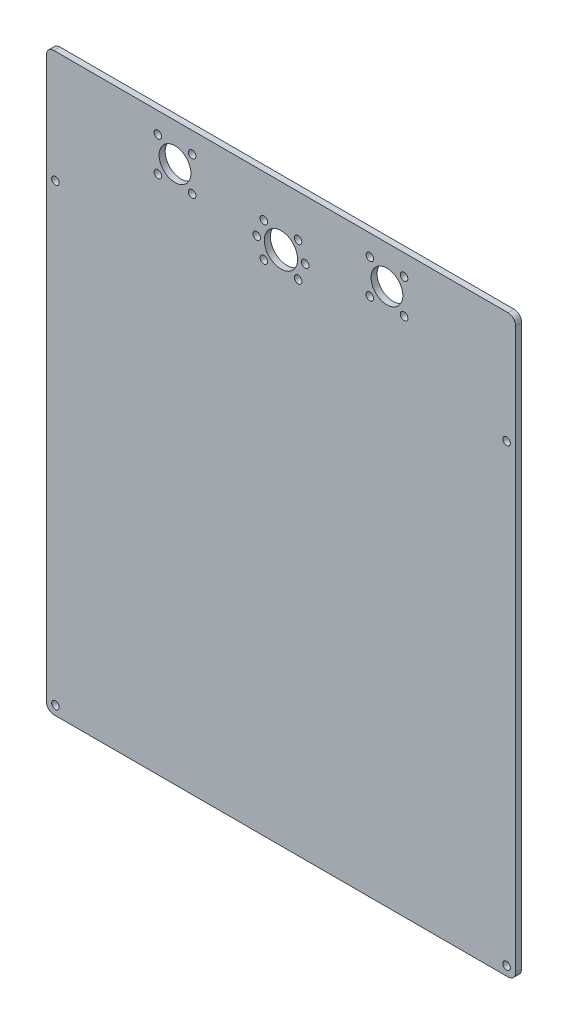
ISO-10303-21;
HEADER;
FILE_DESCRIPTION(('STEP AP214'),'2;1');
FILE_NAME('part.step','',(''),(''),'','','');
FILE_SCHEMA(('AUTOMOTIVE_DESIGN { 1 0 10303 214 1 1 1 1 }'));
ENDSEC;
DATA;
#1=APPLICATION_CONTEXT('core data for automotive mechanical design processes');
#2=APPLICATION_PROTOCOL_DEFINITION('international standard','automotive_design',2000,#1);
#3=PRODUCT_CONTEXT('',#1,'mechanical');
#4=PRODUCT('Part','Part','',(#3));
#5=PRODUCT_RELATED_PRODUCT_CATEGORY('part','',(#4));
#6=PRODUCT_DEFINITION_FORMATION('','',#4);
#7=PRODUCT_DEFINITION_CONTEXT('part definition',#1,'design');
#8=PRODUCT_DEFINITION('design','',#6,#7);
#9=PRODUCT_DEFINITION_SHAPE('','',#8);
#10=(LENGTH_UNIT() NAMED_UNIT(*) SI_UNIT(.MILLI.,.METRE.));
#11=(NAMED_UNIT(*) PLANE_ANGLE_UNIT() SI_UNIT($,.RADIAN.));
#12=(NAMED_UNIT(*) SI_UNIT($,.STERADIAN.) SOLID_ANGLE_UNIT());
#13=UNCERTAINTY_MEASURE_WITH_UNIT(LENGTH_MEASURE(1.E-05),#10,'distance_accuracy_value','');
#14=(GEOMETRIC_REPRESENTATION_CONTEXT(3) GLOBAL_UNCERTAINTY_ASSIGNED_CONTEXT((#13)) GLOBAL_UNIT_ASSIGNED_CONTEXT((#10,
#11,#12)) REPRESENTATION_CONTEXT('',''));
#15=CARTESIAN_POINT('',(0.,0.,0.));
#16=DIRECTION('',(0.,0.,1.));
#17=DIRECTION('',(1.,0.,0.));
#18=AXIS2_PLACEMENT_3D('',#15,#16,#17);
#19=CARTESIAN_POINT('',(0.,0.,4.));
#20=DIRECTION('',(0.,0.,1.));
#21=DIRECTION('',(1.,0.,0.));
#22=AXIS2_PLACEMENT_3D('',#19,#20,#21);
#23=PLANE('',#22);
#24=CARTESIAN_POINT('',(151.939300038153,-21.787610619469,4.));
#25=DIRECTION('',(0.,0.,1.));
#26=DIRECTION('',(1.,0.,0.));
#27=AXIS2_PLACEMENT_3D('',#24,#25,#26);
#28=CIRCLE('',#27,2.5);
#29=CARTESIAN_POINT('',(154.439300038153,-21.787610619469,4.));
#30=VERTEX_POINT('',#29);
#31=EDGE_CURVE('E510',#30,#30,#28,.F.);
#32=ORIENTED_EDGE('',*,*,#31,.T.);
#33=EDGE_LOOP('',(#32));
#34=FACE_BOUND('',#33,.T.);
#35=CARTESIAN_POINT('',(147.253008537138,-33.1013191184539,4.));
#36=DIRECTION('',(0.,0.,1.));
#37=DIRECTION('',(1.,0.,0.));
#38=AXIS2_PLACEMENT_3D('',#35,#36,#37);
#39=CIRCLE('',#38,2.49999999999994);
#40=CARTESIAN_POINT('',(149.753008537137,-33.1013191184539,4.));
#41=VERTEX_POINT('',#40);
#42=EDGE_CURVE('E514',#41,#41,#39,.F.);
#43=ORIENTED_EDGE('',*,*,#42,.T.);
#44=EDGE_LOOP('',(#43));
#45=FACE_BOUND('',#44,.T.);
#46=CARTESIAN_POINT('',(124.625591539168,-33.1013191184539,4.));
#47=DIRECTION('',(0.,0.,1.));
#48=DIRECTION('',(1.,0.,0.));
#49=AXIS2_PLACEMENT_3D('',#46,#47,#48);
#50=CIRCLE('',#49,2.50000000000001);
#51=CARTESIAN_POINT('',(127.125591539168,-33.1013191184539,4.));
#52=VERTEX_POINT('',#51);
#53=EDGE_CURVE('E520',#52,#52,#50,.F.);
#54=ORIENTED_EDGE('',*,*,#53,.T.);
#55=EDGE_LOOP('',(#54));
#56=FACE_BOUND('',#55,.T.);
#57=CARTESIAN_POINT('',(124.625591539168,-10.4739021204844,4.));
#58=DIRECTION('',(0.,0.,1.));
#59=DIRECTION('',(1.,0.,0.));
#60=AXIS2_PLACEMENT_3D('',#57,#58,#59);
#61=CIRCLE('',#60,2.5);
#62=CARTESIAN_POINT('',(127.125591539168,-10.4739021204844,4.));
#63=VERTEX_POINT('',#62);
#64=EDGE_CURVE('E523',#63,#63,#61,.F.);
#65=ORIENTED_EDGE('',*,*,#64,.T.);
#66=EDGE_LOOP('',(#65));
#67=FACE_BOUND('',#66,.T.);
#68=CARTESIAN_POINT('',(119.939300038153,-21.7876106194691,4.));
#69=DIRECTION('',(0.,0.,1.));
#70=DIRECTION('',(1.,0.,0.));
#71=AXIS2_PLACEMENT_3D('',#68,#69,#70);
#72=CIRCLE('',#71,2.5);
#73=CARTESIAN_POINT('',(122.439300038153,-21.7876106194691,4.));
#74=VERTEX_POINT('',#73);
#75=EDGE_CURVE('E526',#74,#74,#72,.F.);
#76=ORIENTED_EDGE('',*,*,#75,.T.);
#77=EDGE_LOOP('',(#76));
#78=FACE_BOUND('',#77,.T.);
#79=CARTESIAN_POINT('',(147.253008537137,-10.4739021204843,4.));
#80=DIRECTION('',(0.,0.,1.));
#81=DIRECTION('',(1.,0.,0.));
#82=AXIS2_PLACEMENT_3D('',#79,#80,#81);
#83=CIRCLE('',#82,2.49999999999994);
#84=CARTESIAN_POINT('',(149.753008537137,-10.4739021204843,4.));
#85=VERTEX_POINT('',#84);
#86=EDGE_CURVE('E545',#85,#85,#83,.F.);
#87=ORIENTED_EDGE('',*,*,#86,.T.);
#88=EDGE_LOOP('',(#87));
#89=FACE_BOUND('',#88,.T.);
#90=CARTESIAN_POINT('',(135.939300038153,-21.7876106194691,4.));
#91=DIRECTION('',(0.,0.,1.));
#92=DIRECTION('',(1.,0.,0.));
#93=AXIS2_PLACEMENT_3D('',#90,#91,#92);
#94=CIRCLE('',#93,11.);
#95=CARTESIAN_POINT('',(146.939300038153,-21.7876106194691,4.));
#96=VERTEX_POINT('',#95);
#97=EDGE_CURVE('E548',#96,#96,#94,.F.);
#98=ORIENTED_EDGE('',*,*,#97,.T.);
#99=EDGE_LOOP('',(#98));
#100=FACE_BOUND('',#99,.T.);
#101=CARTESIAN_POINT('',(65.9393000381526,-7.78761061946914,4.));
#102=DIRECTION('',(0.,0.,1.));
#103=DIRECTION('',(1.,0.,0.));
#104=AXIS2_PLACEMENT_3D('',#101,#102,#103);
#105=CIRCLE('',#104,10.5);
#106=CARTESIAN_POINT('',(76.4393000381526,-7.78761061946914,4.));
#107=VERTEX_POINT('',#106);
#108=EDGE_CURVE('E551',#107,#107,#105,.F.);
#109=ORIENTED_EDGE('',*,*,#108,.T.);
#110=EDGE_LOOP('',(#109));
#111=FACE_BOUND('',#110,.T.);
#112=CARTESIAN_POINT('',(217.253008537137,3.52609787951574,4.));
#113=DIRECTION('',(0.,0.,1.));
#114=DIRECTION('',(1.,0.,0.));
#115=AXIS2_PLACEMENT_3D('',#112,#113,#114);
#116=CIRCLE('',#115,2.5);
#117=CARTESIAN_POINT('',(219.753008537137,3.52609787951574,4.));
#118=VERTEX_POINT('',#117);
#119=EDGE_CURVE('E554',#118,#118,#116,.F.);
#120=ORIENTED_EDGE('',*,*,#119,.T.);
#121=EDGE_LOOP('',(#120));
#122=FACE_BOUND('',#121,.T.);
#123=CARTESIAN_POINT('',(194.625591539168,3.52609787951574,4.));
#124=DIRECTION('',(0.,0.,1.));
#125=DIRECTION('',(1.,0.,0.));
#126=AXIS2_PLACEMENT_3D('',#123,#124,#125);
#127=CIRCLE('',#126,2.5);
#128=CARTESIAN_POINT('',(197.125591539168,3.52609787951574,4.));
#129=VERTEX_POINT('',#128);
#130=EDGE_CURVE('E557',#129,#129,#127,.F.);
#131=ORIENTED_EDGE('',*,*,#130,.T.);
#132=EDGE_LOOP('',(#131));
#133=FACE_BOUND('',#132,.T.);
#134=CARTESIAN_POINT('',(194.625591539168,-19.1013191184537,4.));
#135=DIRECTION('',(0.,0.,1.));
#136=DIRECTION('',(1.,0.,0.));
#137=AXIS2_PLACEMENT_3D('',#134,#135,#136);
#138=CIRCLE('',#137,2.5);
#139=CARTESIAN_POINT('',(197.125591539168,-19.1013191184537,4.));
#140=VERTEX_POINT('',#139);
#141=EDGE_CURVE('E560',#140,#140,#138,.F.);
#142=ORIENTED_EDGE('',*,*,#141,.T.);
#143=EDGE_LOOP('',(#142));
#144=FACE_BOUND('',#143,.T.);
#145=CARTESIAN_POINT('',(77.2530085371374,-19.1013191184539,4.));
#146=DIRECTION('',(0.,0.,1.));
#147=DIRECTION('',(1.,0.,0.));
#148=AXIS2_PLACEMENT_3D('',#145,#146,#147);
#149=CIRCLE('',#148,2.50000000000001);
#150=CARTESIAN_POINT('',(79.7530085371375,-19.1013191184539,4.));
#151=VERTEX_POINT('',#150);
#152=EDGE_CURVE('E563',#151,#151,#149,.F.);
#153=ORIENTED_EDGE('',*,*,#152,.T.);
#154=EDGE_LOOP('',(#153));
#155=FACE_BOUND('',#154,.T.);
#156=CARTESIAN_POINT('',(54.6255915391679,-19.1013191184539,4.));
#157=DIRECTION('',(0.,0.,1.));
#158=DIRECTION('',(1.,0.,0.));
#159=AXIS2_PLACEMENT_3D('',#156,#157,#158);
#160=CIRCLE('',#159,2.5);
#161=CARTESIAN_POINT('',(57.1255915391679,-19.1013191184539,4.));
#162=VERTEX_POINT('',#161);
#163=EDGE_CURVE('E566',#162,#162,#160,.F.);
#164=ORIENTED_EDGE('',*,*,#163,.T.);
#165=EDGE_LOOP('',(#164));
#166=FACE_BOUND('',#165,.T.);
#167=CARTESIAN_POINT('',(54.6255915391678,3.52609787951563,4.));
#168=DIRECTION('',(0.,0.,1.));
#169=DIRECTION('',(1.,0.,0.));
#170=AXIS2_PLACEMENT_3D('',#167,#168,#169);
#171=CIRCLE('',#170,2.5);
#172=CARTESIAN_POINT('',(57.1255915391678,3.52609787951563,4.));
#173=VERTEX_POINT('',#172);
#174=EDGE_CURVE('E569',#173,#173,#171,.F.);
#175=ORIENTED_EDGE('',*,*,#174,.T.);
#176=EDGE_LOOP('',(#175));
#177=FACE_BOUND('',#176,.T.);
#178=CARTESIAN_POINT('',(77.2530085371374,3.52609787951563,4.));
#179=DIRECTION('',(0.,0.,1.));
#180=DIRECTION('',(1.,0.,0.));
#181=AXIS2_PLACEMENT_3D('',#178,#179,#180);
#182=CIRCLE('',#181,2.50000000000001);
#183=CARTESIAN_POINT('',(79.7530085371374,3.52609787951563,4.));
#184=VERTEX_POINT('',#183);
#185=EDGE_CURVE('E572',#184,#184,#182,.F.);
#186=ORIENTED_EDGE('',*,*,#185,.T.);
#187=EDGE_LOOP('',(#186));
#188=FACE_BOUND('',#187,.T.);
#189=CARTESIAN_POINT('',(217.253008537137,-19.1013191184537,4.));
#190=DIRECTION('',(0.,0.,1.));
#191=DIRECTION('',(1.,0.,0.));
#192=AXIS2_PLACEMENT_3D('',#189,#190,#191);
#193=CIRCLE('',#192,2.5);
#194=CARTESIAN_POINT('',(219.753008537137,-19.1013191184537,4.));
#195=VERTEX_POINT('',#194);
#196=EDGE_CURVE('E575',#195,#195,#193,.F.);
#197=ORIENTED_EDGE('',*,*,#196,.T.);
#198=EDGE_LOOP('',(#197));
#199=FACE_BOUND('',#198,.T.);
#200=CARTESIAN_POINT('',(205.939300038153,-7.78761061946903,4.));
#201=DIRECTION('',(0.,0.,1.));
#202=DIRECTION('',(1.,0.,0.));
#203=AXIS2_PLACEMENT_3D('',#200,#201,#202);
#204=CIRCLE('',#203,10.5);
#205=CARTESIAN_POINT('',(216.439300038153,-7.78761061946903,4.));
#206=VERTEX_POINT('',#205);
#207=EDGE_CURVE('E292',#206,#206,#204,.F.);
#208=ORIENTED_EDGE('',*,*,#207,.T.);
#209=EDGE_LOOP('',(#208));
#210=FACE_BOUND('',#209,.T.);
#211=DIRECTION('',(0.,1.,0.));
#212=VECTOR('',#211,1.);
#213=CARTESIAN_POINT('',(290.939300038153,17.212389380531,4.));
#214=LINE('',#213,#212);
#215=CARTESIAN_POINT('',(290.939300038153,-357.787610619469,4.));
#216=VERTEX_POINT('',#215);
#217=CARTESIAN_POINT('',(290.939300038153,12.212389380531,4.));
#218=VERTEX_POINT('',#217);
#219=EDGE_CURVE('E295',#216,#218,#214,.T.);
#220=ORIENTED_EDGE('',*,*,#219,.T.);
#221=CARTESIAN_POINT('',(285.939300038153,12.212389380531,4.));
#222=DIRECTION('',(0.,0.,1.));
#223=DIRECTION('',(1.,0.,0.));
#224=AXIS2_PLACEMENT_3D('',#221,#222,#223);
#225=CIRCLE('',#224,5.);
#226=CARTESIAN_POINT('',(285.939300038153,17.212389380531,4.));
#227=VERTEX_POINT('',#226);
#228=EDGE_CURVE('E327',#218,#227,#225,.T.);
#229=ORIENTED_EDGE('',*,*,#228,.T.);
#230=DIRECTION('',(-1.,0.,0.));
#231=VECTOR('',#230,1.);
#232=CARTESIAN_POINT('',(-19.0606999618473,17.212389380531,4.));
#233=LINE('',#232,#231);
#234=CARTESIAN_POINT('',(-14.0606999618473,17.212389380531,4.));
#235=VERTEX_POINT('',#234);
#236=EDGE_CURVE('E198',#227,#235,#233,.T.);
#237=ORIENTED_EDGE('',*,*,#236,.T.);
#238=CARTESIAN_POINT('',(-14.0606999618473,12.212389380531,4.));
#239=DIRECTION('',(0.,0.,1.));
#240=DIRECTION('',(1.,0.,0.));
#241=AXIS2_PLACEMENT_3D('',#238,#239,#240);
#242=CIRCLE('',#241,5.);
#243=CARTESIAN_POINT('',(-19.0606999618473,12.212389380531,4.));
#244=VERTEX_POINT('',#243);
#245=EDGE_CURVE('E316',#235,#244,#242,.T.);
#246=ORIENTED_EDGE('',*,*,#245,.T.);
#247=DIRECTION('',(0.,-1.,0.));
#248=VECTOR('',#247,1.);
#249=CARTESIAN_POINT('',(-19.0606999618473,17.212389380531,4.));
#250=LINE('',#249,#248);
#251=CARTESIAN_POINT('',(-19.0606999618473,-357.787610619469,4.));
#252=VERTEX_POINT('',#251);
#253=EDGE_CURVE('E205',#244,#252,#250,.T.);
#254=ORIENTED_EDGE('',*,*,#253,.T.);
#255=CARTESIAN_POINT('',(-14.0606999618473,-357.787610619469,4.));
#256=DIRECTION('',(0.,0.,1.));
#257=DIRECTION('',(1.,0.,0.));
#258=AXIS2_PLACEMENT_3D('',#255,#256,#257);
#259=CIRCLE('',#258,5.);
#260=CARTESIAN_POINT('',(-14.0606999618473,-362.787610619469,4.));
#261=VERTEX_POINT('',#260);
#262=EDGE_CURVE('E133',#252,#261,#259,.T.);
#263=ORIENTED_EDGE('',*,*,#262,.T.);
#264=DIRECTION('',(1.,0.,0.));
#265=VECTOR('',#264,1.);
#266=CARTESIAN_POINT('',(-19.0606999618473,-362.787610619469,4.));
#267=LINE('',#266,#265);
#268=CARTESIAN_POINT('',(285.939300038153,-362.787610619469,4.));
#269=VERTEX_POINT('',#268);
#270=EDGE_CURVE('E208',#261,#269,#267,.T.);
#271=ORIENTED_EDGE('',*,*,#270,.T.);
#272=CARTESIAN_POINT('',(285.939300038153,-357.787610619469,4.));
#273=DIRECTION('',(0.,0.,1.));
#274=DIRECTION('',(1.,0.,0.));
#275=AXIS2_PLACEMENT_3D('',#272,#273,#274);
#276=CIRCLE('',#275,5.);
#277=EDGE_CURVE('E311',#269,#216,#276,.T.);
#278=ORIENTED_EDGE('',*,*,#277,.T.);
#279=EDGE_LOOP('',(#220,#229,#237,#246,#254,#263,#271,#278));
#280=FACE_BOUND('',#279,.T.);
#281=CARTESIAN_POINT('',(-13.0606999618473,-56.787610619469,4.));
#282=DIRECTION('',(0.,0.,1.));
#283=DIRECTION('',(1.,0.,0.));
#284=AXIS2_PLACEMENT_3D('',#281,#282,#283);
#285=CIRCLE('',#284,2.5);
#286=CARTESIAN_POINT('',(-10.5606999618473,-56.787610619469,4.));
#287=VERTEX_POINT('',#286);
#288=EDGE_CURVE('E541',#287,#287,#285,.T.);
#289=ORIENTED_EDGE('',*,*,#288,.F.);
#290=EDGE_LOOP('',(#289));
#291=FACE_BOUND('',#290,.T.);
#292=CARTESIAN_POINT('',(-13.0606999618474,-356.787610619469,4.));
#293=DIRECTION('',(0.,0.,1.));
#294=DIRECTION('',(1.,0.,0.));
#295=AXIS2_PLACEMENT_3D('',#292,#293,#294);
#296=CIRCLE('',#295,2.5);
#297=CARTESIAN_POINT('',(-10.5606999618474,-356.787610619469,4.));
#298=VERTEX_POINT('',#297);
#299=EDGE_CURVE('E458',#298,#298,#296,.T.);
#300=ORIENTED_EDGE('',*,*,#299,.F.);
#301=EDGE_LOOP('',(#300));
#302=FACE_BOUND('',#301,.T.);
#303=CARTESIAN_POINT('',(284.939300038153,-356.787610619469,4.));
#304=DIRECTION('',(0.,0.,1.));
#305=DIRECTION('',(1.,0.,0.));
#306=AXIS2_PLACEMENT_3D('',#303,#304,#305);
#307=CIRCLE('',#306,2.50000000000002);
#308=CARTESIAN_POINT('',(287.439300038153,-356.787610619469,4.));
#309=VERTEX_POINT('',#308);
#310=EDGE_CURVE('E532',#309,#309,#307,.T.);
#311=ORIENTED_EDGE('',*,*,#310,.F.);
#312=EDGE_LOOP('',(#311));
#313=FACE_BOUND('',#312,.T.);
#314=CARTESIAN_POINT('',(284.939300038153,-56.787610619469,4.));
#315=DIRECTION('',(0.,0.,1.));
#316=DIRECTION('',(1.,0.,0.));
#317=AXIS2_PLACEMENT_3D('',#314,#315,#316);
#318=CIRCLE('',#317,2.50000000000002);
#319=CARTESIAN_POINT('',(287.439300038153,-56.787610619469,4.));
#320=VERTEX_POINT('',#319);
#321=EDGE_CURVE('E528',#320,#320,#318,.T.);
#322=ORIENTED_EDGE('',*,*,#321,.F.);
#323=EDGE_LOOP('',(#322));
#324=FACE_BOUND('',#323,.T.);
#325=ADVANCED_FACE('F111',(#34,#45,#56,#67,#78,#89,#100,#111,#122,#133,#144,#155,#166,#177,#188,
#199,#210,#280,#291,#302,#313,#324),#23,.T.);
#326=CARTESIAN_POINT('',(0.,0.,0.));
#327=DIRECTION('',(0.,0.,1.));
#328=DIRECTION('',(1.,0.,0.));
#329=AXIS2_PLACEMENT_3D('',#326,#327,#328);
#330=PLANE('',#329);
#331=CARTESIAN_POINT('',(151.939300038153,-21.787610619469,0.));
#332=DIRECTION('',(0.,0.,1.));
#333=DIRECTION('',(1.,0.,0.));
#334=AXIS2_PLACEMENT_3D('',#331,#332,#333);
#335=CIRCLE('',#334,2.5);
#336=CARTESIAN_POINT('',(154.439300038153,-21.787610619469,0.));
#337=VERTEX_POINT('',#336);
#338=EDGE_CURVE('E269',#337,#337,#335,.T.);
#339=ORIENTED_EDGE('',*,*,#338,.T.);
#340=EDGE_LOOP('',(#339));
#341=FACE_BOUND('',#340,.T.);
#342=CARTESIAN_POINT('',(147.253008537138,-33.1013191184539,0.));
#343=DIRECTION('',(0.,0.,1.));
#344=DIRECTION('',(1.,0.,0.));
#345=AXIS2_PLACEMENT_3D('',#342,#343,#344);
#346=CIRCLE('',#345,2.49999999999994);
#347=CARTESIAN_POINT('',(149.753008537137,-33.1013191184539,0.));
#348=VERTEX_POINT('',#347);
#349=EDGE_CURVE('E610',#348,#348,#346,.T.);
#350=ORIENTED_EDGE('',*,*,#349,.T.);
#351=EDGE_LOOP('',(#350));
#352=FACE_BOUND('',#351,.T.);
#353=CARTESIAN_POINT('',(124.625591539168,-33.1013191184539,0.));
#354=DIRECTION('',(0.,0.,1.));
#355=DIRECTION('',(1.,0.,0.));
#356=AXIS2_PLACEMENT_3D('',#353,#354,#355);
#357=CIRCLE('',#356,2.50000000000001);
#358=CARTESIAN_POINT('',(127.125591539168,-33.1013191184539,0.));
#359=VERTEX_POINT('',#358);
#360=EDGE_CURVE('E278',#359,#359,#357,.T.);
#361=ORIENTED_EDGE('',*,*,#360,.T.);
#362=EDGE_LOOP('',(#361));
#363=FACE_BOUND('',#362,.T.);
#364=CARTESIAN_POINT('',(124.625591539168,-10.4739021204844,0.));
#365=DIRECTION('',(0.,0.,1.));
#366=DIRECTION('',(1.,0.,0.));
#367=AXIS2_PLACEMENT_3D('',#364,#365,#366);
#368=CIRCLE('',#367,2.5);
#369=CARTESIAN_POINT('',(127.125591539168,-10.4739021204844,0.));
#370=VERTEX_POINT('',#369);
#371=EDGE_CURVE('E232',#370,#370,#368,.T.);
#372=ORIENTED_EDGE('',*,*,#371,.T.);
#373=EDGE_LOOP('',(#372));
#374=FACE_BOUND('',#373,.T.);
#375=CARTESIAN_POINT('',(119.939300038153,-21.7876106194691,0.));
#376=DIRECTION('',(0.,0.,1.));
#377=DIRECTION('',(1.,0.,0.));
#378=AXIS2_PLACEMENT_3D('',#375,#376,#377);
#379=CIRCLE('',#378,2.5);
#380=CARTESIAN_POINT('',(122.439300038153,-21.7876106194691,0.));
#381=VERTEX_POINT('',#380);
#382=EDGE_CURVE('E599',#381,#381,#379,.T.);
#383=ORIENTED_EDGE('',*,*,#382,.T.);
#384=EDGE_LOOP('',(#383));
#385=FACE_BOUND('',#384,.T.);
#386=CARTESIAN_POINT('',(284.939300038153,-356.787610619469,0.));
#387=DIRECTION('',(0.,0.,-1.));
#388=DIRECTION('',(-1.,0.,0.));
#389=AXIS2_PLACEMENT_3D('',#386,#387,#388);
#390=CIRCLE('',#389,2.50000000000002);
#391=CARTESIAN_POINT('',(282.439300038153,-356.787610619469,0.));
#392=VERTEX_POINT('',#391);
#393=EDGE_CURVE('E461',#392,#392,#390,.T.);
#394=ORIENTED_EDGE('',*,*,#393,.F.);
#395=EDGE_LOOP('',(#394));
#396=FACE_BOUND('',#395,.T.);
#397=CARTESIAN_POINT('',(-13.0606999618473,-56.787610619469,0.));
#398=DIRECTION('',(0.,0.,-1.));
#399=DIRECTION('',(-1.,0.,0.));
#400=AXIS2_PLACEMENT_3D('',#397,#398,#399);
#401=CIRCLE('',#400,2.5);
#402=CARTESIAN_POINT('',(-15.5606999618473,-56.787610619469,0.));
#403=VERTEX_POINT('',#402);
#404=EDGE_CURVE('E270',#403,#403,#401,.T.);
#405=ORIENTED_EDGE('',*,*,#404,.F.);
#406=EDGE_LOOP('',(#405));
#407=FACE_BOUND('',#406,.T.);
#408=CARTESIAN_POINT('',(147.253008537137,-10.4739021204843,0.));
#409=DIRECTION('',(0.,0.,1.));
#410=DIRECTION('',(1.,0.,0.));
#411=AXIS2_PLACEMENT_3D('',#408,#409,#410);
#412=CIRCLE('',#411,2.49999999999994);
#413=CARTESIAN_POINT('',(149.753008537137,-10.4739021204843,0.));
#414=VERTEX_POINT('',#413);
#415=EDGE_CURVE('E264',#414,#414,#412,.T.);
#416=ORIENTED_EDGE('',*,*,#415,.T.);
#417=EDGE_LOOP('',(#416));
#418=FACE_BOUND('',#417,.T.);
#419=CARTESIAN_POINT('',(135.939300038153,-21.7876106194691,0.));
#420=DIRECTION('',(0.,0.,-1.));
#421=DIRECTION('',(-1.,0.,0.));
#422=AXIS2_PLACEMENT_3D('',#419,#420,#421);
#423=CIRCLE('',#422,11.);
#424=CARTESIAN_POINT('',(124.939300038153,-21.7876106194691,0.));
#425=VERTEX_POINT('',#424);
#426=EDGE_CURVE('E256',#425,#425,#423,.F.);
#427=ORIENTED_EDGE('',*,*,#426,.T.);
#428=EDGE_LOOP('',(#427));
#429=FACE_BOUND('',#428,.T.);
#430=CARTESIAN_POINT('',(65.9393000381526,-7.78761061946914,0.));
#431=DIRECTION('',(0.,0.,-1.));
#432=DIRECTION('',(-1.,0.,0.));
#433=AXIS2_PLACEMENT_3D('',#430,#431,#432);
#434=CIRCLE('',#433,10.5);
#435=CARTESIAN_POINT('',(55.4393000381526,-7.78761061946914,0.));
#436=VERTEX_POINT('',#435);
#437=EDGE_CURVE('E483',#436,#436,#434,.F.);
#438=ORIENTED_EDGE('',*,*,#437,.T.);
#439=EDGE_LOOP('',(#438));
#440=FACE_BOUND('',#439,.T.);
#441=CARTESIAN_POINT('',(217.253008537137,3.52609787951574,0.));
#442=DIRECTION('',(0.,0.,1.));
#443=DIRECTION('',(1.,0.,0.));
#444=AXIS2_PLACEMENT_3D('',#441,#442,#443);
#445=CIRCLE('',#444,2.5);
#446=CARTESIAN_POINT('',(219.753008537137,3.52609787951574,0.));
#447=VERTEX_POINT('',#446);
#448=EDGE_CURVE('E487',#447,#447,#445,.T.);
#449=ORIENTED_EDGE('',*,*,#448,.T.);
#450=EDGE_LOOP('',(#449));
#451=FACE_BOUND('',#450,.T.);
#452=CARTESIAN_POINT('',(194.625591539168,3.52609787951574,0.));
#453=DIRECTION('',(0.,0.,1.));
#454=DIRECTION('',(1.,0.,0.));
#455=AXIS2_PLACEMENT_3D('',#452,#453,#454);
#456=CIRCLE('',#455,2.5);
#457=CARTESIAN_POINT('',(197.125591539168,3.52609787951574,0.));
#458=VERTEX_POINT('',#457);
#459=EDGE_CURVE('E491',#458,#458,#456,.T.);
#460=ORIENTED_EDGE('',*,*,#459,.T.);
#461=EDGE_LOOP('',(#460));
#462=FACE_BOUND('',#461,.T.);
#463=CARTESIAN_POINT('',(194.625591539168,-19.1013191184537,0.));
#464=DIRECTION('',(0.,0.,1.));
#465=DIRECTION('',(1.,0.,0.));
#466=AXIS2_PLACEMENT_3D('',#463,#464,#465);
#467=CIRCLE('',#466,2.5);
#468=CARTESIAN_POINT('',(197.125591539168,-19.1013191184537,0.));
#469=VERTEX_POINT('',#468);
#470=EDGE_CURVE('E252',#469,#469,#467,.T.);
#471=ORIENTED_EDGE('',*,*,#470,.T.);
#472=EDGE_LOOP('',(#471));
#473=FACE_BOUND('',#472,.T.);
#474=CARTESIAN_POINT('',(77.2530085371374,-19.1013191184539,0.));
#475=DIRECTION('',(0.,0.,1.));
#476=DIRECTION('',(1.,0.,0.));
#477=AXIS2_PLACEMENT_3D('',#474,#475,#476);
#478=CIRCLE('',#477,2.50000000000001);
#479=CARTESIAN_POINT('',(79.7530085371375,-19.1013191184539,0.));
#480=VERTEX_POINT('',#479);
#481=EDGE_CURVE('E238',#480,#480,#478,.T.);
#482=ORIENTED_EDGE('',*,*,#481,.T.);
#483=EDGE_LOOP('',(#482));
#484=FACE_BOUND('',#483,.T.);
#485=CARTESIAN_POINT('',(54.6255915391679,-19.1013191184539,0.));
#486=DIRECTION('',(0.,0.,1.));
#487=DIRECTION('',(1.,0.,0.));
#488=AXIS2_PLACEMENT_3D('',#485,#486,#487);
#489=CIRCLE('',#488,2.5);
#490=CARTESIAN_POINT('',(57.1255915391679,-19.1013191184539,0.));
#491=VERTEX_POINT('',#490);
#492=EDGE_CURVE('E231',#491,#491,#489,.T.);
#493=ORIENTED_EDGE('',*,*,#492,.T.);
#494=EDGE_LOOP('',(#493));
#495=FACE_BOUND('',#494,.T.);
#496=CARTESIAN_POINT('',(54.6255915391678,3.52609787951563,0.));
#497=DIRECTION('',(0.,0.,1.));
#498=DIRECTION('',(1.,0.,0.));
#499=AXIS2_PLACEMENT_3D('',#496,#497,#498);
#500=CIRCLE('',#499,2.5);
#501=CARTESIAN_POINT('',(57.1255915391678,3.52609787951563,0.));
#502=VERTEX_POINT('',#501);
#503=EDGE_CURVE('E225',#502,#502,#500,.T.);
#504=ORIENTED_EDGE('',*,*,#503,.T.);
#505=EDGE_LOOP('',(#504));
#506=FACE_BOUND('',#505,.T.);
#507=CARTESIAN_POINT('',(77.2530085371374,3.52609787951563,0.));
#508=DIRECTION('',(0.,0.,1.));
#509=DIRECTION('',(1.,0.,0.));
#510=AXIS2_PLACEMENT_3D('',#507,#508,#509);
#511=CIRCLE('',#510,2.50000000000001);
#512=CARTESIAN_POINT('',(79.7530085371374,3.52609787951563,0.));
#513=VERTEX_POINT('',#512);
#514=EDGE_CURVE('E230',#513,#513,#511,.T.);
#515=ORIENTED_EDGE('',*,*,#514,.T.);
#516=EDGE_LOOP('',(#515));
#517=FACE_BOUND('',#516,.T.);
#518=CARTESIAN_POINT('',(217.253008537137,-19.1013191184537,0.));
#519=DIRECTION('',(0.,0.,1.));
#520=DIRECTION('',(1.,0.,0.));
#521=AXIS2_PLACEMENT_3D('',#518,#519,#520);
#522=CIRCLE('',#521,2.5);
#523=CARTESIAN_POINT('',(219.753008537137,-19.1013191184537,0.));
#524=VERTEX_POINT('',#523);
#525=EDGE_CURVE('E248',#524,#524,#522,.T.);
#526=ORIENTED_EDGE('',*,*,#525,.T.);
#527=EDGE_LOOP('',(#526));
#528=FACE_BOUND('',#527,.T.);
#529=CARTESIAN_POINT('',(205.939300038153,-7.78761061946903,0.));
#530=DIRECTION('',(0.,0.,-1.));
#531=DIRECTION('',(-1.,0.,0.));
#532=AXIS2_PLACEMENT_3D('',#529,#530,#531);
#533=CIRCLE('',#532,10.5);
#534=CARTESIAN_POINT('',(195.439300038153,-7.78761061946903,0.));
#535=VERTEX_POINT('',#534);
#536=EDGE_CURVE('E508',#535,#535,#533,.F.);
#537=ORIENTED_EDGE('',*,*,#536,.T.);
#538=EDGE_LOOP('',(#537));
#539=FACE_BOUND('',#538,.T.);
#540=DIRECTION('',(-1.,0.,0.));
#541=VECTOR('',#540,1.);
#542=CARTESIAN_POINT('',(-19.0606999618473,17.212389380531,0.));
#543=LINE('',#542,#541);
#544=CARTESIAN_POINT('',(285.939300038153,17.212389380531,0.));
#545=VERTEX_POINT('',#544);
#546=CARTESIAN_POINT('',(-14.0606999618473,17.212389380531,0.));
#547=VERTEX_POINT('',#546);
#548=EDGE_CURVE('E195',#545,#547,#543,.T.);
#549=ORIENTED_EDGE('',*,*,#548,.F.);
#550=CARTESIAN_POINT('',(285.939300038153,12.212389380531,0.));
#551=DIRECTION('',(0.,0.,1.));
#552=DIRECTION('',(1.,0.,0.));
#553=AXIS2_PLACEMENT_3D('',#550,#551,#552);
#554=CIRCLE('',#553,5.);
#555=CARTESIAN_POINT('',(290.939300038153,12.212389380531,0.));
#556=VERTEX_POINT('',#555);
#557=EDGE_CURVE('E178',#545,#556,#554,.F.);
#558=ORIENTED_EDGE('',*,*,#557,.T.);
#559=DIRECTION('',(0.,1.,0.));
#560=VECTOR('',#559,1.);
#561=CARTESIAN_POINT('',(290.939300038153,17.212389380531,0.));
#562=LINE('',#561,#560);
#563=CARTESIAN_POINT('',(290.939300038153,-357.787610619469,0.));
#564=VERTEX_POINT('',#563);
#565=EDGE_CURVE('E206',#564,#556,#562,.T.);
#566=ORIENTED_EDGE('',*,*,#565,.F.);
#567=CARTESIAN_POINT('',(285.939300038153,-357.787610619469,0.));
#568=DIRECTION('',(0.,0.,1.));
#569=DIRECTION('',(1.,0.,0.));
#570=AXIS2_PLACEMENT_3D('',#567,#568,#569);
#571=CIRCLE('',#570,5.);
#572=CARTESIAN_POINT('',(285.939300038153,-362.787610619469,0.));
#573=VERTEX_POINT('',#572);
#574=EDGE_CURVE('E199',#564,#573,#571,.F.);
#575=ORIENTED_EDGE('',*,*,#574,.T.);
#576=DIRECTION('',(1.,0.,0.));
#577=VECTOR('',#576,1.);
#578=CARTESIAN_POINT('',(-19.0606999618473,-362.787610619469,0.));
#579=LINE('',#578,#577);
#580=CARTESIAN_POINT('',(-14.0606999618473,-362.787610619469,0.));
#581=VERTEX_POINT('',#580);
#582=EDGE_CURVE('E210',#581,#573,#579,.T.);
#583=ORIENTED_EDGE('',*,*,#582,.F.);
#584=CARTESIAN_POINT('',(-14.0606999618473,-357.787610619469,0.));
#585=DIRECTION('',(0.,0.,1.));
#586=DIRECTION('',(1.,0.,0.));
#587=AXIS2_PLACEMENT_3D('',#584,#585,#586);
#588=CIRCLE('',#587,5.);
#589=CARTESIAN_POINT('',(-19.0606999618473,-357.787610619469,0.));
#590=VERTEX_POINT('',#589);
#591=EDGE_CURVE('E338',#581,#590,#588,.F.);
#592=ORIENTED_EDGE('',*,*,#591,.T.);
#593=DIRECTION('',(0.,-1.,0.));
#594=VECTOR('',#593,1.);
#595=CARTESIAN_POINT('',(-19.0606999618473,17.212389380531,0.));
#596=LINE('',#595,#594);
#597=CARTESIAN_POINT('',(-19.0606999618473,12.212389380531,0.));
#598=VERTEX_POINT('',#597);
#599=EDGE_CURVE('E289',#598,#590,#596,.T.);
#600=ORIENTED_EDGE('',*,*,#599,.F.);
#601=CARTESIAN_POINT('',(-14.0606999618473,12.212389380531,0.));
#602=DIRECTION('',(0.,0.,1.));
#603=DIRECTION('',(1.,0.,0.));
#604=AXIS2_PLACEMENT_3D('',#601,#602,#603);
#605=CIRCLE('',#604,5.);
#606=EDGE_CURVE('E189',#598,#547,#605,.F.);
#607=ORIENTED_EDGE('',*,*,#606,.T.);
#608=EDGE_LOOP('',(#549,#558,#566,#575,#583,#592,#600,#607));
#609=FACE_BOUND('',#608,.T.);
#610=CARTESIAN_POINT('',(-13.0606999618474,-356.787610619469,0.));
#611=DIRECTION('',(0.,0.,-1.));
#612=DIRECTION('',(-1.,0.,0.));
#613=AXIS2_PLACEMENT_3D('',#610,#611,#612);
#614=CIRCLE('',#613,2.5);
#615=CARTESIAN_POINT('',(-15.5606999618474,-356.787610619469,0.));
#616=VERTEX_POINT('',#615);
#617=EDGE_CURVE('E277',#616,#616,#614,.T.);
#618=ORIENTED_EDGE('',*,*,#617,.F.);
#619=EDGE_LOOP('',(#618));
#620=FACE_BOUND('',#619,.T.);
#621=CARTESIAN_POINT('',(284.939300038153,-56.787610619469,0.));
#622=DIRECTION('',(0.,0.,-1.));
#623=DIRECTION('',(-1.,0.,0.));
#624=AXIS2_PLACEMENT_3D('',#621,#622,#623);
#625=CIRCLE('',#624,2.50000000000002);
#626=CARTESIAN_POINT('',(282.439300038153,-56.787610619469,0.));
#627=VERTEX_POINT('',#626);
#628=EDGE_CURVE('E271',#627,#627,#625,.T.);
#629=ORIENTED_EDGE('',*,*,#628,.F.);
#630=EDGE_LOOP('',(#629));
#631=FACE_BOUND('',#630,.T.);
#632=ADVANCED_FACE('F202',(#341,#352,#363,#374,#385,#396,#407,#418,#429,#440,#451,#462,#473,
#484,#495,#506,#517,#528,#539,#609,#620,#631),#330,.F.);
#633=CARTESIAN_POINT('',(-19.0606999618473,17.212389380531,4.));
#634=DIRECTION('',(1.,0.,0.));
#635=DIRECTION('',(0.,1.,0.));
#636=AXIS2_PLACEMENT_3D('',#633,#634,#635);
#637=PLANE('',#636);
#638=ORIENTED_EDGE('',*,*,#253,.F.);
#639=DIRECTION('',(0.,0.,-1.));
#640=VECTOR('',#639,1.);
#641=CARTESIAN_POINT('',(-19.0606999618473,12.212389380531,4.));
#642=LINE('',#641,#640);
#643=EDGE_CURVE('E322',#244,#598,#642,.T.);
#644=ORIENTED_EDGE('',*,*,#643,.T.);
#645=ORIENTED_EDGE('',*,*,#599,.T.);
#646=DIRECTION('',(0.,0.,-1.));
#647=VECTOR('',#646,1.);
#648=CARTESIAN_POINT('',(-19.0606999618473,-357.787610619469,4.));
#649=LINE('',#648,#647);
#650=EDGE_CURVE('E326',#590,#252,#649,.F.);
#651=ORIENTED_EDGE('',*,*,#650,.T.);
#652=EDGE_LOOP('',(#638,#644,#645,#651));
#653=FACE_BOUND('',#652,.T.);
#654=ADVANCED_FACE('F335',(#653),#637,.F.);
#655=CARTESIAN_POINT('',(-19.0606999618473,-362.787610619469,4.));
#656=DIRECTION('',(0.,1.,0.));
#657=DIRECTION('',(0.,0.,1.));
#658=AXIS2_PLACEMENT_3D('',#655,#656,#657);
#659=PLANE('',#658);
#660=ORIENTED_EDGE('',*,*,#270,.F.);
#661=DIRECTION('',(0.,0.,-1.));
#662=VECTOR('',#661,1.);
#663=CARTESIAN_POINT('',(-14.0606999618473,-362.787610619469,4.));
#664=LINE('',#663,#662);
#665=EDGE_CURVE('E13',#261,#581,#664,.T.);
#666=ORIENTED_EDGE('',*,*,#665,.T.);
#667=ORIENTED_EDGE('',*,*,#582,.T.);
#668=DIRECTION('',(0.,0.,-1.));
#669=VECTOR('',#668,1.);
#670=CARTESIAN_POINT('',(285.939300038153,-362.787610619469,4.));
#671=LINE('',#670,#669);
#672=EDGE_CURVE('E120',#573,#269,#671,.F.);
#673=ORIENTED_EDGE('',*,*,#672,.T.);
#674=EDGE_LOOP('',(#660,#666,#667,#673));
#675=FACE_BOUND('',#674,.T.);
#676=ADVANCED_FACE('F345',(#675),#659,.F.);
#677=CARTESIAN_POINT('',(290.939300038153,17.212389380531,4.));
#678=DIRECTION('',(-1.,0.,0.));
#679=DIRECTION('',(0.,-1.,0.));
#680=AXIS2_PLACEMENT_3D('',#677,#678,#679);
#681=PLANE('',#680);
#682=ORIENTED_EDGE('',*,*,#565,.T.);
#683=DIRECTION('',(0.,0.,-1.));
#684=VECTOR('',#683,1.);
#685=CARTESIAN_POINT('',(290.939300038153,12.212389380531,4.));
#686=LINE('',#685,#684);
#687=EDGE_CURVE('E183',#556,#218,#686,.F.);
#688=ORIENTED_EDGE('',*,*,#687,.T.);
#689=ORIENTED_EDGE('',*,*,#219,.F.);
#690=DIRECTION('',(0.,0.,-1.));
#691=VECTOR('',#690,1.);
#692=CARTESIAN_POINT('',(290.939300038153,-357.787610619469,4.));
#693=LINE('',#692,#691);
#694=EDGE_CURVE('E188',#216,#564,#693,.T.);
#695=ORIENTED_EDGE('',*,*,#694,.T.);
#696=EDGE_LOOP('',(#682,#688,#689,#695));
#697=FACE_BOUND('',#696,.T.);
#698=ADVANCED_FACE('F350',(#697),#681,.F.);
#699=CARTESIAN_POINT('',(-19.0606999618473,17.212389380531,4.));
#700=DIRECTION('',(0.,-1.,0.));
#701=DIRECTION('',(0.,0.,-1.));
#702=AXIS2_PLACEMENT_3D('',#699,#700,#701);
#703=PLANE('',#702);
#704=ORIENTED_EDGE('',*,*,#236,.F.);
#705=DIRECTION('',(0.,0.,-1.));
#706=VECTOR('',#705,1.);
#707=CARTESIAN_POINT('',(285.939300038153,17.212389380531,4.));
#708=LINE('',#707,#706);
#709=EDGE_CURVE('E182',#227,#545,#708,.T.);
#710=ORIENTED_EDGE('',*,*,#709,.T.);
#711=ORIENTED_EDGE('',*,*,#548,.T.);
#712=DIRECTION('',(0.,0.,-1.));
#713=VECTOR('',#712,1.);
#714=CARTESIAN_POINT('',(-14.0606999618473,17.212389380531,4.));
#715=LINE('',#714,#713);
#716=EDGE_CURVE('E200',#547,#235,#715,.F.);
#717=ORIENTED_EDGE('',*,*,#716,.T.);
#718=EDGE_LOOP('',(#704,#710,#711,#717));
#719=FACE_BOUND('',#718,.T.);
#720=ADVANCED_FACE('F194',(#719),#703,.F.);
#721=CARTESIAN_POINT('',(285.939300038153,12.212389380531,4.));
#722=DIRECTION('',(0.,0.,-1.));
#723=DIRECTION('',(-1.,0.,0.));
#724=AXIS2_PLACEMENT_3D('',#721,#722,#723);
#725=CYLINDRICAL_SURFACE('',#724,5.);
#726=ORIENTED_EDGE('',*,*,#228,.F.);
#727=ORIENTED_EDGE('',*,*,#687,.F.);
#728=ORIENTED_EDGE('',*,*,#557,.F.);
#729=ORIENTED_EDGE('',*,*,#709,.F.);
#730=EDGE_LOOP('',(#726,#727,#728,#729));
#731=FACE_BOUND('',#730,.T.);
#732=ADVANCED_FACE('F181',(#731),#725,.T.);
#733=CARTESIAN_POINT('',(-14.0606999618473,12.212389380531,4.));
#734=DIRECTION('',(0.,0.,-1.));
#735=DIRECTION('',(-1.,0.,0.));
#736=AXIS2_PLACEMENT_3D('',#733,#734,#735);
#737=CYLINDRICAL_SURFACE('',#736,5.);
#738=ORIENTED_EDGE('',*,*,#245,.F.);
#739=ORIENTED_EDGE('',*,*,#716,.F.);
#740=ORIENTED_EDGE('',*,*,#606,.F.);
#741=ORIENTED_EDGE('',*,*,#643,.F.);
#742=EDGE_LOOP('',(#738,#739,#740,#741));
#743=FACE_BOUND('',#742,.T.);
#744=ADVANCED_FACE('F337',(#743),#737,.T.);
#745=CARTESIAN_POINT('',(-14.0606999618473,-357.787610619469,4.));
#746=DIRECTION('',(0.,0.,-1.));
#747=DIRECTION('',(-1.,0.,0.));
#748=AXIS2_PLACEMENT_3D('',#745,#746,#747);
#749=CYLINDRICAL_SURFACE('',#748,5.);
#750=ORIENTED_EDGE('',*,*,#262,.F.);
#751=ORIENTED_EDGE('',*,*,#650,.F.);
#752=ORIENTED_EDGE('',*,*,#591,.F.);
#753=ORIENTED_EDGE('',*,*,#665,.F.);
#754=EDGE_LOOP('',(#750,#751,#752,#753));
#755=FACE_BOUND('',#754,.T.);
#756=ADVANCED_FACE('F831',(#755),#749,.T.);
#757=CARTESIAN_POINT('',(285.939300038153,-357.787610619469,4.));
#758=DIRECTION('',(0.,0.,-1.));
#759=DIRECTION('',(-1.,0.,0.));
#760=AXIS2_PLACEMENT_3D('',#757,#758,#759);
#761=CYLINDRICAL_SURFACE('',#760,5.);
#762=ORIENTED_EDGE('',*,*,#277,.F.);
#763=ORIENTED_EDGE('',*,*,#672,.F.);
#764=ORIENTED_EDGE('',*,*,#574,.F.);
#765=ORIENTED_EDGE('',*,*,#694,.F.);
#766=EDGE_LOOP('',(#762,#763,#764,#765));
#767=FACE_BOUND('',#766,.T.);
#768=ADVANCED_FACE('F113',(#767),#761,.T.);
#769=CARTESIAN_POINT('',(205.939300038153,-7.78761061946903,10.));
#770=DIRECTION('',(0.,0.,-1.));
#771=DIRECTION('',(-1.,0.,0.));
#772=AXIS2_PLACEMENT_3D('',#769,#770,#771);
#773=CYLINDRICAL_SURFACE('',#772,10.5);
#774=ORIENTED_EDGE('',*,*,#207,.F.);
#775=EDGE_LOOP('',(#774));
#776=FACE_BOUND('',#775,.T.);
#777=ORIENTED_EDGE('',*,*,#536,.F.);
#778=EDGE_LOOP('',(#777));
#779=FACE_BOUND('',#778,.T.);
#780=ADVANCED_FACE('F370',(#776,#779),#773,.F.);
#781=CARTESIAN_POINT('',(217.253008537137,-19.1013191184537,10.));
#782=DIRECTION('',(0.,0.,-1.));
#783=DIRECTION('',(-1.,0.,0.));
#784=AXIS2_PLACEMENT_3D('',#781,#782,#783);
#785=CYLINDRICAL_SURFACE('',#784,2.5);
#786=ORIENTED_EDGE('',*,*,#196,.F.);
#787=EDGE_LOOP('',(#786));
#788=FACE_BOUND('',#787,.T.);
#789=ORIENTED_EDGE('',*,*,#525,.F.);
#790=EDGE_LOOP('',(#789));
#791=FACE_BOUND('',#790,.T.);
#792=ADVANCED_FACE('F373',(#788,#791),#785,.F.);
#793=CARTESIAN_POINT('',(77.2530085371374,3.52609787951563,10.));
#794=DIRECTION('',(0.,0.,-1.));
#795=DIRECTION('',(-1.,0.,0.));
#796=AXIS2_PLACEMENT_3D('',#793,#794,#795);
#797=CYLINDRICAL_SURFACE('',#796,2.50000000000001);
#798=ORIENTED_EDGE('',*,*,#185,.F.);
#799=EDGE_LOOP('',(#798));
#800=FACE_BOUND('',#799,.T.);
#801=ORIENTED_EDGE('',*,*,#514,.F.);
#802=EDGE_LOOP('',(#801));
#803=FACE_BOUND('',#802,.T.);
#804=ADVANCED_FACE('F397',(#800,#803),#797,.F.);
#805=CARTESIAN_POINT('',(54.6255915391678,3.52609787951563,10.));
#806=DIRECTION('',(0.,0.,-1.));
#807=DIRECTION('',(-1.,0.,0.));
#808=AXIS2_PLACEMENT_3D('',#805,#806,#807);
#809=CYLINDRICAL_SURFACE('',#808,2.5);
#810=ORIENTED_EDGE('',*,*,#174,.F.);
#811=EDGE_LOOP('',(#810));
#812=FACE_BOUND('',#811,.T.);
#813=ORIENTED_EDGE('',*,*,#503,.F.);
#814=EDGE_LOOP('',(#813));
#815=FACE_BOUND('',#814,.T.);
#816=ADVANCED_FACE('F400',(#812,#815),#809,.F.);
#817=CARTESIAN_POINT('',(54.6255915391679,-19.1013191184539,10.));
#818=DIRECTION('',(0.,0.,-1.));
#819=DIRECTION('',(-1.,0.,0.));
#820=AXIS2_PLACEMENT_3D('',#817,#818,#819);
#821=CYLINDRICAL_SURFACE('',#820,2.5);
#822=ORIENTED_EDGE('',*,*,#163,.F.);
#823=EDGE_LOOP('',(#822));
#824=FACE_BOUND('',#823,.T.);
#825=ORIENTED_EDGE('',*,*,#492,.F.);
#826=EDGE_LOOP('',(#825));
#827=FACE_BOUND('',#826,.T.);
#828=ADVANCED_FACE('F407',(#824,#827),#821,.F.);
#829=CARTESIAN_POINT('',(77.2530085371374,-19.1013191184539,10.));
#830=DIRECTION('',(0.,0.,-1.));
#831=DIRECTION('',(-1.,0.,0.));
#832=AXIS2_PLACEMENT_3D('',#829,#830,#831);
#833=CYLINDRICAL_SURFACE('',#832,2.50000000000001);
#834=ORIENTED_EDGE('',*,*,#152,.F.);
#835=EDGE_LOOP('',(#834));
#836=FACE_BOUND('',#835,.T.);
#837=ORIENTED_EDGE('',*,*,#481,.F.);
#838=EDGE_LOOP('',(#837));
#839=FACE_BOUND('',#838,.T.);
#840=ADVANCED_FACE('F379',(#836,#839),#833,.F.);
#841=CARTESIAN_POINT('',(194.625591539168,-19.1013191184537,10.));
#842=DIRECTION('',(0.,0.,-1.));
#843=DIRECTION('',(-1.,0.,0.));
#844=AXIS2_PLACEMENT_3D('',#841,#842,#843);
#845=CYLINDRICAL_SURFACE('',#844,2.5);
#846=ORIENTED_EDGE('',*,*,#141,.F.);
#847=EDGE_LOOP('',(#846));
#848=FACE_BOUND('',#847,.T.);
#849=ORIENTED_EDGE('',*,*,#470,.F.);
#850=EDGE_LOOP('',(#849));
#851=FACE_BOUND('',#850,.T.);
#852=ADVANCED_FACE('F375',(#848,#851),#845,.F.);
#853=CARTESIAN_POINT('',(194.625591539168,3.52609787951574,10.));
#854=DIRECTION('',(0.,0.,-1.));
#855=DIRECTION('',(-1.,0.,0.));
#856=AXIS2_PLACEMENT_3D('',#853,#854,#855);
#857=CYLINDRICAL_SURFACE('',#856,2.5);
#858=ORIENTED_EDGE('',*,*,#130,.F.);
#859=EDGE_LOOP('',(#858));
#860=FACE_BOUND('',#859,.T.);
#861=ORIENTED_EDGE('',*,*,#459,.F.);
#862=EDGE_LOOP('',(#861));
#863=FACE_BOUND('',#862,.T.);
#864=ADVANCED_FACE('F378',(#860,#863),#857,.F.);
#865=CARTESIAN_POINT('',(217.253008537137,3.52609787951574,10.));
#866=DIRECTION('',(0.,0.,-1.));
#867=DIRECTION('',(-1.,0.,0.));
#868=AXIS2_PLACEMENT_3D('',#865,#866,#867);
#869=CYLINDRICAL_SURFACE('',#868,2.5);
#870=ORIENTED_EDGE('',*,*,#119,.F.);
#871=EDGE_LOOP('',(#870));
#872=FACE_BOUND('',#871,.T.);
#873=ORIENTED_EDGE('',*,*,#448,.F.);
#874=EDGE_LOOP('',(#873));
#875=FACE_BOUND('',#874,.T.);
#876=ADVANCED_FACE('F383',(#872,#875),#869,.F.);
#877=CARTESIAN_POINT('',(65.9393000381526,-7.78761061946914,10.));
#878=DIRECTION('',(0.,0.,-1.));
#879=DIRECTION('',(-1.,0.,0.));
#880=AXIS2_PLACEMENT_3D('',#877,#878,#879);
#881=CYLINDRICAL_SURFACE('',#880,10.5);
#882=ORIENTED_EDGE('',*,*,#108,.F.);
#883=EDGE_LOOP('',(#882));
#884=FACE_BOUND('',#883,.T.);
#885=ORIENTED_EDGE('',*,*,#437,.F.);
#886=EDGE_LOOP('',(#885));
#887=FACE_BOUND('',#886,.T.);
#888=ADVANCED_FACE('F387',(#884,#887),#881,.F.);
#889=CARTESIAN_POINT('',(135.939300038153,-21.7876106194691,10.));
#890=DIRECTION('',(0.,0.,-1.));
#891=DIRECTION('',(-1.,0.,0.));
#892=AXIS2_PLACEMENT_3D('',#889,#890,#891);
#893=CYLINDRICAL_SURFACE('',#892,11.);
#894=ORIENTED_EDGE('',*,*,#97,.F.);
#895=EDGE_LOOP('',(#894));
#896=FACE_BOUND('',#895,.T.);
#897=ORIENTED_EDGE('',*,*,#426,.F.);
#898=EDGE_LOOP('',(#897));
#899=FACE_BOUND('',#898,.T.);
#900=ADVANCED_FACE('F391',(#896,#899),#893,.F.);
#901=CARTESIAN_POINT('',(147.253008537137,-10.4739021204843,10.));
#902=DIRECTION('',(0.,0.,-1.));
#903=DIRECTION('',(-1.,0.,0.));
#904=AXIS2_PLACEMENT_3D('',#901,#902,#903);
#905=CYLINDRICAL_SURFACE('',#904,2.49999999999994);
#906=ORIENTED_EDGE('',*,*,#86,.F.);
#907=EDGE_LOOP('',(#906));
#908=FACE_BOUND('',#907,.T.);
#909=ORIENTED_EDGE('',*,*,#415,.F.);
#910=EDGE_LOOP('',(#909));
#911=FACE_BOUND('',#910,.T.);
#912=ADVANCED_FACE('F395',(#908,#911),#905,.F.);
#913=CARTESIAN_POINT('',(-13.0606999618473,-56.787610619469,10.));
#914=DIRECTION('',(0.,0.,-1.));
#915=DIRECTION('',(-1.,0.,0.));
#916=AXIS2_PLACEMENT_3D('',#913,#914,#915);
#917=CYLINDRICAL_SURFACE('',#916,2.5);
#918=ORIENTED_EDGE('',*,*,#288,.T.);
#919=EDGE_LOOP('',(#918));
#920=FACE_BOUND('',#919,.T.);
#921=ORIENTED_EDGE('',*,*,#404,.T.);
#922=EDGE_LOOP('',(#921));
#923=FACE_BOUND('',#922,.T.);
#924=ADVANCED_FACE('F436',(#920,#923),#917,.F.);
#925=CARTESIAN_POINT('',(-13.0606999618474,-356.787610619469,10.));
#926=DIRECTION('',(0.,0.,-1.));
#927=DIRECTION('',(-1.,0.,0.));
#928=AXIS2_PLACEMENT_3D('',#925,#926,#927);
#929=CYLINDRICAL_SURFACE('',#928,2.5);
#930=ORIENTED_EDGE('',*,*,#299,.T.);
#931=EDGE_LOOP('',(#930));
#932=FACE_BOUND('',#931,.T.);
#933=ORIENTED_EDGE('',*,*,#617,.T.);
#934=EDGE_LOOP('',(#933));
#935=FACE_BOUND('',#934,.T.);
#936=ADVANCED_FACE('F439',(#932,#935),#929,.F.);
#937=CARTESIAN_POINT('',(284.939300038153,-356.787610619469,10.));
#938=DIRECTION('',(0.,0.,-1.));
#939=DIRECTION('',(-1.,0.,0.));
#940=AXIS2_PLACEMENT_3D('',#937,#938,#939);
#941=CYLINDRICAL_SURFACE('',#940,2.50000000000002);
#942=ORIENTED_EDGE('',*,*,#310,.T.);
#943=EDGE_LOOP('',(#942));
#944=FACE_BOUND('',#943,.T.);
#945=ORIENTED_EDGE('',*,*,#393,.T.);
#946=EDGE_LOOP('',(#945));
#947=FACE_BOUND('',#946,.T.);
#948=ADVANCED_FACE('F446',(#944,#947),#941,.F.);
#949=CARTESIAN_POINT('',(284.939300038153,-56.787610619469,10.));
#950=DIRECTION('',(0.,0.,-1.));
#951=DIRECTION('',(-1.,0.,0.));
#952=AXIS2_PLACEMENT_3D('',#949,#950,#951);
#953=CYLINDRICAL_SURFACE('',#952,2.50000000000002);
#954=ORIENTED_EDGE('',*,*,#321,.T.);
#955=EDGE_LOOP('',(#954));
#956=FACE_BOUND('',#955,.T.);
#957=ORIENTED_EDGE('',*,*,#628,.T.);
#958=EDGE_LOOP('',(#957));
#959=FACE_BOUND('',#958,.T.);
#960=ADVANCED_FACE('F423',(#956,#959),#953,.F.);
#961=CARTESIAN_POINT('',(119.939300038153,-21.7876106194691,10.));
#962=DIRECTION('',(0.,0.,-1.));
#963=DIRECTION('',(-1.,0.,0.));
#964=AXIS2_PLACEMENT_3D('',#961,#962,#963);
#965=CYLINDRICAL_SURFACE('',#964,2.5);
#966=ORIENTED_EDGE('',*,*,#75,.F.);
#967=EDGE_LOOP('',(#966));
#968=FACE_BOUND('',#967,.T.);
#969=ORIENTED_EDGE('',*,*,#382,.F.);
#970=EDGE_LOOP('',(#969));
#971=FACE_BOUND('',#970,.T.);
#972=ADVANCED_FACE('F419',(#968,#971),#965,.F.);
#973=CARTESIAN_POINT('',(124.625591539168,-10.4739021204844,10.));
#974=DIRECTION('',(0.,0.,-1.));
#975=DIRECTION('',(-1.,0.,0.));
#976=AXIS2_PLACEMENT_3D('',#973,#974,#975);
#977=CYLINDRICAL_SURFACE('',#976,2.5);
#978=ORIENTED_EDGE('',*,*,#64,.F.);
#979=EDGE_LOOP('',(#978));
#980=FACE_BOUND('',#979,.T.);
#981=ORIENTED_EDGE('',*,*,#371,.F.);
#982=EDGE_LOOP('',(#981));
#983=FACE_BOUND('',#982,.T.);
#984=ADVANCED_FACE('F415',(#980,#983),#977,.F.);
#985=CARTESIAN_POINT('',(124.625591539168,-33.1013191184539,10.));
#986=DIRECTION('',(0.,0.,-1.));
#987=DIRECTION('',(-1.,0.,0.));
#988=AXIS2_PLACEMENT_3D('',#985,#986,#987);
#989=CYLINDRICAL_SURFACE('',#988,2.50000000000001);
#990=ORIENTED_EDGE('',*,*,#53,.F.);
#991=EDGE_LOOP('',(#990));
#992=FACE_BOUND('',#991,.T.);
#993=ORIENTED_EDGE('',*,*,#360,.F.);
#994=EDGE_LOOP('',(#993));
#995=FACE_BOUND('',#994,.T.);
#996=ADVANCED_FACE('F418',(#992,#995),#989,.F.);
#997=CARTESIAN_POINT('',(147.253008537138,-33.1013191184539,10.));
#998=DIRECTION('',(0.,0.,-1.));
#999=DIRECTION('',(-1.,0.,0.));
#1000=AXIS2_PLACEMENT_3D('',#997,#998,#999);
#1001=CYLINDRICAL_SURFACE('',#1000,2.49999999999994);
#1002=ORIENTED_EDGE('',*,*,#42,.F.);
#1003=EDGE_LOOP('',(#1002));
#1004=FACE_BOUND('',#1003,.T.);
#1005=ORIENTED_EDGE('',*,*,#349,.F.);
#1006=EDGE_LOOP('',(#1005));
#1007=FACE_BOUND('',#1006,.T.);
#1008=ADVANCED_FACE('F428',(#1004,#1007),#1001,.F.);
#1009=CARTESIAN_POINT('',(151.939300038153,-21.787610619469,10.));
#1010=DIRECTION('',(0.,0.,-1.));
#1011=DIRECTION('',(-1.,0.,0.));
#1012=AXIS2_PLACEMENT_3D('',#1009,#1010,#1011);
#1013=CYLINDRICAL_SURFACE('',#1012,2.5);
#1014=ORIENTED_EDGE('',*,*,#31,.F.);
#1015=EDGE_LOOP('',(#1014));
#1016=FACE_BOUND('',#1015,.T.);
#1017=ORIENTED_EDGE('',*,*,#338,.F.);
#1018=EDGE_LOOP('',(#1017));
#1019=FACE_BOUND('',#1018,.T.);
#1020=ADVANCED_FACE('F425',(#1016,#1019),#1013,.F.);
#1021=CLOSED_SHELL('',(#325,#632,#654,#676,#698,#720,#732,#744,#756,#768,#780,#792,#804,#816,
#828,#840,#852,#864,#876,#888,#900,#912,#924,#936,#948,#960,#972,#984,#996,#1008,#1020));
#1022=MANIFOLD_SOLID_BREP('B2',#1021);
#1023=ADVANCED_BREP_SHAPE_REPRESENTATION('',(#18,#1022),#14);
#1024=SHAPE_DEFINITION_REPRESENTATION(#9,#1023);
ENDSEC;
END-ISO-10303-21;
